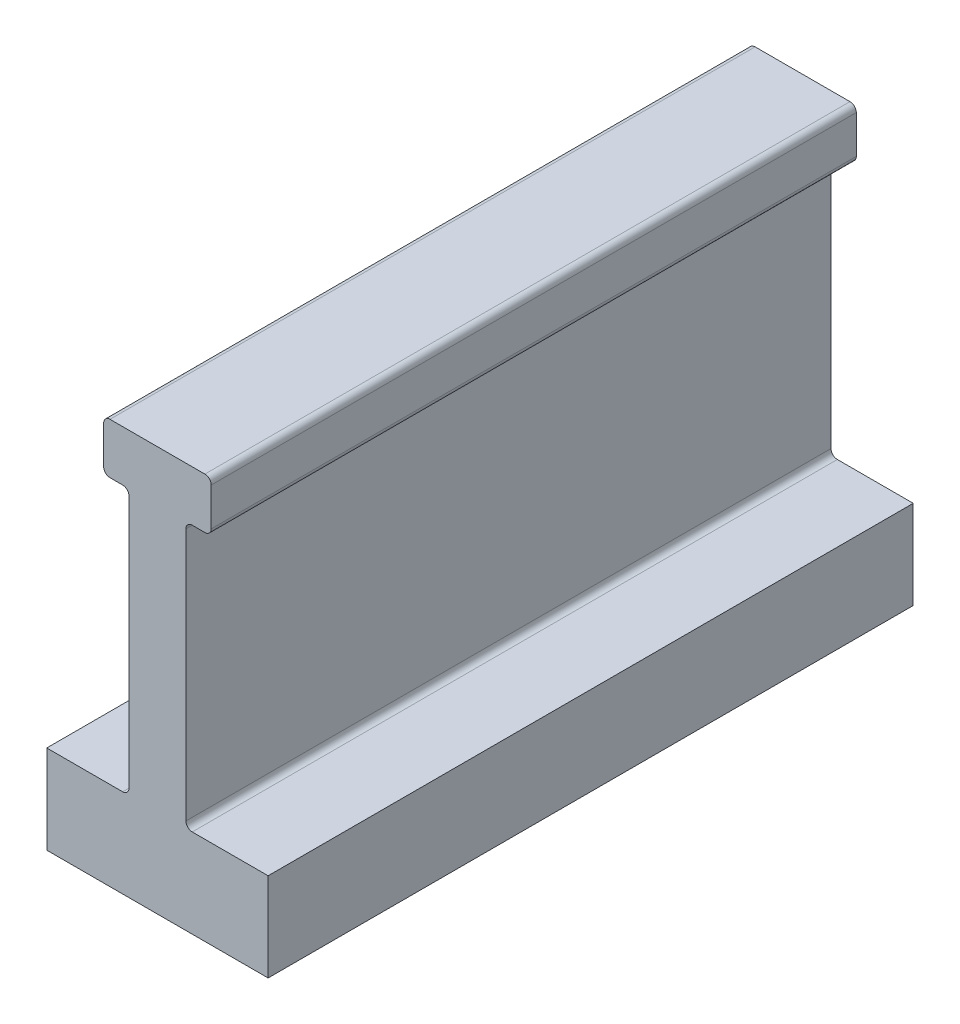
ISO-10303-21;
HEADER;
FILE_DESCRIPTION(('STEP AP214'),'2;1');
FILE_NAME('part.step','',(''),(''),'','','');
FILE_SCHEMA(('AUTOMOTIVE_DESIGN { 1 0 10303 214 1 1 1 1 }'));
ENDSEC;
DATA;
#1=APPLICATION_CONTEXT('core data for automotive mechanical design processes');
#2=APPLICATION_PROTOCOL_DEFINITION('international standard','automotive_design',2000,#1);
#3=PRODUCT_CONTEXT('',#1,'mechanical');
#4=PRODUCT('Part','Part','',(#3));
#5=PRODUCT_RELATED_PRODUCT_CATEGORY('part','',(#4));
#6=PRODUCT_DEFINITION_FORMATION('','',#4);
#7=PRODUCT_DEFINITION_CONTEXT('part definition',#1,'design');
#8=PRODUCT_DEFINITION('design','',#6,#7);
#9=PRODUCT_DEFINITION_SHAPE('','',#8);
#10=(LENGTH_UNIT() NAMED_UNIT(*) SI_UNIT(.MILLI.,.METRE.));
#11=(NAMED_UNIT(*) PLANE_ANGLE_UNIT() SI_UNIT($,.RADIAN.));
#12=(NAMED_UNIT(*) SI_UNIT($,.STERADIAN.) SOLID_ANGLE_UNIT());
#13=UNCERTAINTY_MEASURE_WITH_UNIT(LENGTH_MEASURE(1.E-05),#10,'distance_accuracy_value','');
#14=(GEOMETRIC_REPRESENTATION_CONTEXT(3) GLOBAL_UNCERTAINTY_ASSIGNED_CONTEXT((#13)) GLOBAL_UNIT_ASSIGNED_CONTEXT((#10,
#11,#12)) REPRESENTATION_CONTEXT('',''));
#15=CARTESIAN_POINT('',(0.,0.,0.));
#16=DIRECTION('',(0.,0.,1.));
#17=DIRECTION('',(1.,0.,0.));
#18=AXIS2_PLACEMENT_3D('',#15,#16,#17);
#19=CARTESIAN_POINT('',(-8.75,-7.,51.));
#20=DIRECTION('',(1.,0.,0.));
#21=DIRECTION('',(0.,0.,-1.));
#22=AXIS2_PLACEMENT_3D('',#19,#20,#21);
#23=PLANE('',#22);
#24=DIRECTION('',(0.,-1.,0.));
#25=VECTOR('',#24,1.);
#26=CARTESIAN_POINT('',(-8.75,-7.,0.));
#27=LINE('',#26,#25);
#28=CARTESIAN_POINT('',(-8.75,-7.,0.));
#29=VERTEX_POINT('',#28);
#30=CARTESIAN_POINT('',(-8.75,-14.,0.));
#31=VERTEX_POINT('',#30);
#32=EDGE_CURVE('E201',#29,#31,#27,.T.);
#33=ORIENTED_EDGE('',*,*,#32,.T.);
#34=DIRECTION('',(0.,0.,-1.));
#35=VECTOR('',#34,1.);
#36=CARTESIAN_POINT('',(-8.75,-14.,51.));
#37=LINE('',#36,#35);
#38=CARTESIAN_POINT('',(-8.75,-14.,51.));
#39=VERTEX_POINT('',#38);
#40=EDGE_CURVE('E11',#39,#31,#37,.T.);
#41=ORIENTED_EDGE('',*,*,#40,.F.);
#42=DIRECTION('',(0.,-1.,0.));
#43=VECTOR('',#42,1.);
#44=CARTESIAN_POINT('',(-8.75,-7.,51.));
#45=LINE('',#44,#43);
#46=CARTESIAN_POINT('',(-8.75,-7.,51.));
#47=VERTEX_POINT('',#46);
#48=EDGE_CURVE('E239',#47,#39,#45,.T.);
#49=ORIENTED_EDGE('',*,*,#48,.F.);
#50=DIRECTION('',(0.,0.,-1.));
#51=VECTOR('',#50,1.);
#52=CARTESIAN_POINT('',(-8.75,-7.,51.));
#53=LINE('',#52,#51);
#54=EDGE_CURVE('E197',#47,#29,#53,.T.);
#55=ORIENTED_EDGE('',*,*,#54,.T.);
#56=EDGE_LOOP('',(#33,#41,#49,#55));
#57=FACE_BOUND('',#56,.T.);
#58=ADVANCED_FACE('F33',(#57),#23,.F.);
#59=CARTESIAN_POINT('',(8.75,-14.,51.));
#60=DIRECTION('',(0.,1.,0.));
#61=DIRECTION('',(-1.,0.,0.));
#62=AXIS2_PLACEMENT_3D('',#59,#60,#61);
#63=PLANE('',#62);
#64=DIRECTION('',(1.,0.,0.));
#65=VECTOR('',#64,1.);
#66=CARTESIAN_POINT('',(8.75,-14.,0.));
#67=LINE('',#66,#65);
#68=CARTESIAN_POINT('',(8.75,-14.,0.));
#69=VERTEX_POINT('',#68);
#70=EDGE_CURVE('E204',#31,#69,#67,.T.);
#71=ORIENTED_EDGE('',*,*,#70,.T.);
#72=DIRECTION('',(0.,0.,-1.));
#73=VECTOR('',#72,1.);
#74=CARTESIAN_POINT('',(8.75,-14.,51.));
#75=LINE('',#74,#73);
#76=CARTESIAN_POINT('',(8.75,-14.,51.));
#77=VERTEX_POINT('',#76);
#78=EDGE_CURVE('E41',#77,#69,#75,.T.);
#79=ORIENTED_EDGE('',*,*,#78,.F.);
#80=DIRECTION('',(1.,0.,0.));
#81=VECTOR('',#80,1.);
#82=CARTESIAN_POINT('',(8.75,-14.,51.));
#83=LINE('',#82,#81);
#84=EDGE_CURVE('E128',#39,#77,#83,.T.);
#85=ORIENTED_EDGE('',*,*,#84,.F.);
#86=ORIENTED_EDGE('',*,*,#40,.T.);
#87=EDGE_LOOP('',(#71,#79,#85,#86));
#88=FACE_BOUND('',#87,.T.);
#89=ADVANCED_FACE('F357',(#88),#63,.F.);
#90=CARTESIAN_POINT('',(8.75,-14.,51.));
#91=DIRECTION('',(-1.,0.,0.));
#92=DIRECTION('',(0.,0.,1.));
#93=AXIS2_PLACEMENT_3D('',#90,#91,#92);
#94=PLANE('',#93);
#95=DIRECTION('',(0.,1.,0.));
#96=VECTOR('',#95,1.);
#97=CARTESIAN_POINT('',(8.75,-14.,0.));
#98=LINE('',#97,#96);
#99=CARTESIAN_POINT('',(8.75,-7.,0.));
#100=VERTEX_POINT('',#99);
#101=EDGE_CURVE('E206',#69,#100,#98,.T.);
#102=ORIENTED_EDGE('',*,*,#101,.T.);
#103=DIRECTION('',(0.,0.,-1.));
#104=VECTOR('',#103,1.);
#105=CARTESIAN_POINT('',(8.75,-7.,51.));
#106=LINE('',#105,#104);
#107=CARTESIAN_POINT('',(8.75,-7.,51.));
#108=VERTEX_POINT('',#107);
#109=EDGE_CURVE('E282',#108,#100,#106,.T.);
#110=ORIENTED_EDGE('',*,*,#109,.F.);
#111=DIRECTION('',(0.,1.,0.));
#112=VECTOR('',#111,1.);
#113=CARTESIAN_POINT('',(8.75,-14.,51.));
#114=LINE('',#113,#112);
#115=EDGE_CURVE('E290',#77,#108,#114,.T.);
#116=ORIENTED_EDGE('',*,*,#115,.F.);
#117=ORIENTED_EDGE('',*,*,#78,.T.);
#118=EDGE_LOOP('',(#102,#110,#116,#117));
#119=FACE_BOUND('',#118,.T.);
#120=ADVANCED_FACE('F288',(#119),#94,.F.);
#121=CARTESIAN_POINT('',(8.75,-7.,51.));
#122=DIRECTION('',(0.,-1.,0.));
#123=DIRECTION('',(0.,0.,-1.));
#124=AXIS2_PLACEMENT_3D('',#121,#122,#123);
#125=PLANE('',#124);
#126=DIRECTION('',(-1.,0.,0.));
#127=VECTOR('',#126,1.);
#128=CARTESIAN_POINT('',(8.75,-7.,0.));
#129=LINE('',#128,#127);
#130=CARTESIAN_POINT('',(2.75,-7.,0.));
#131=VERTEX_POINT('',#130);
#132=EDGE_CURVE('E208',#100,#131,#129,.T.);
#133=ORIENTED_EDGE('',*,*,#132,.T.);
#134=DIRECTION('',(0.,0.,-1.));
#135=VECTOR('',#134,1.);
#136=CARTESIAN_POINT('',(2.75,-7.,51.));
#137=LINE('',#136,#135);
#138=CARTESIAN_POINT('',(2.75,-7.,51.));
#139=VERTEX_POINT('',#138);
#140=EDGE_CURVE('E279',#139,#131,#137,.T.);
#141=ORIENTED_EDGE('',*,*,#140,.F.);
#142=DIRECTION('',(-1.,0.,0.));
#143=VECTOR('',#142,1.);
#144=CARTESIAN_POINT('',(8.75,-7.,51.));
#145=LINE('',#144,#143);
#146=EDGE_CURVE('E308',#108,#139,#145,.T.);
#147=ORIENTED_EDGE('',*,*,#146,.F.);
#148=ORIENTED_EDGE('',*,*,#109,.T.);
#149=EDGE_LOOP('',(#133,#141,#147,#148));
#150=FACE_BOUND('',#149,.T.);
#151=ADVANCED_FACE('F299',(#150),#125,.F.);
#152=CARTESIAN_POINT('',(2.75,-6.5,51.));
#153=DIRECTION('',(0.,0.,-1.));
#154=DIRECTION('',(-1.,0.,0.));
#155=AXIS2_PLACEMENT_3D('',#152,#153,#154);
#156=CYLINDRICAL_SURFACE('',#155,0.5);
#157=CARTESIAN_POINT('',(2.75,-6.5,0.));
#158=DIRECTION('',(0.,0.,-1.));
#159=DIRECTION('',(1.,0.,0.));
#160=AXIS2_PLACEMENT_3D('',#157,#158,#159);
#161=CIRCLE('',#160,0.5);
#162=CARTESIAN_POINT('',(2.25,-6.49999999999999,0.));
#163=VERTEX_POINT('',#162);
#164=EDGE_CURVE('E210',#131,#163,#161,.T.);
#165=ORIENTED_EDGE('',*,*,#164,.T.);
#166=DIRECTION('',(0.,0.,-1.));
#167=VECTOR('',#166,1.);
#168=CARTESIAN_POINT('',(2.25,-6.49999999999999,51.));
#169=LINE('',#168,#167);
#170=CARTESIAN_POINT('',(2.25,-6.49999999999999,51.));
#171=VERTEX_POINT('',#170);
#172=EDGE_CURVE('E276',#171,#163,#169,.T.);
#173=ORIENTED_EDGE('',*,*,#172,.F.);
#174=CARTESIAN_POINT('',(2.75,-6.5,51.));
#175=DIRECTION('',(0.,0.,-1.));
#176=DIRECTION('',(1.,0.,0.));
#177=AXIS2_PLACEMENT_3D('',#174,#175,#176);
#178=CIRCLE('',#177,0.5);
#179=EDGE_CURVE('E305',#139,#171,#178,.T.);
#180=ORIENTED_EDGE('',*,*,#179,.F.);
#181=ORIENTED_EDGE('',*,*,#140,.T.);
#182=EDGE_LOOP('',(#165,#173,#180,#181));
#183=FACE_BOUND('',#182,.T.);
#184=ADVANCED_FACE('F303',(#183),#156,.F.);
#185=CARTESIAN_POINT('',(2.25,-6.49999999999999,51.));
#186=DIRECTION('',(-1.,0.,0.));
#187=DIRECTION('',(0.,0.,1.));
#188=AXIS2_PLACEMENT_3D('',#185,#186,#187);
#189=PLANE('',#188);
#190=DIRECTION('',(0.,1.,0.));
#191=VECTOR('',#190,1.);
#192=CARTESIAN_POINT('',(2.25,-6.49999999999999,0.));
#193=LINE('',#192,#191);
#194=CARTESIAN_POINT('',(2.25,13.5,0.));
#195=VERTEX_POINT('',#194);
#196=EDGE_CURVE('E212',#163,#195,#193,.T.);
#197=ORIENTED_EDGE('',*,*,#196,.T.);
#198=DIRECTION('',(0.,0.,-1.));
#199=VECTOR('',#198,1.);
#200=CARTESIAN_POINT('',(2.25,13.5,51.));
#201=LINE('',#200,#199);
#202=CARTESIAN_POINT('',(2.25,13.5,51.));
#203=VERTEX_POINT('',#202);
#204=EDGE_CURVE('E273',#203,#195,#201,.T.);
#205=ORIENTED_EDGE('',*,*,#204,.F.);
#206=DIRECTION('',(0.,1.,0.));
#207=VECTOR('',#206,1.);
#208=CARTESIAN_POINT('',(2.25,-6.49999999999999,51.));
#209=LINE('',#208,#207);
#210=EDGE_CURVE('E307',#171,#203,#209,.T.);
#211=ORIENTED_EDGE('',*,*,#210,.F.);
#212=ORIENTED_EDGE('',*,*,#172,.T.);
#213=EDGE_LOOP('',(#197,#205,#211,#212));
#214=FACE_BOUND('',#213,.T.);
#215=ADVANCED_FACE('F370',(#214),#189,.F.);
#216=CARTESIAN_POINT('',(2.75,13.5,51.));
#217=DIRECTION('',(0.,0.,-1.));
#218=DIRECTION('',(-1.,0.,0.));
#219=AXIS2_PLACEMENT_3D('',#216,#217,#218);
#220=CYLINDRICAL_SURFACE('',#219,0.5);
#221=CARTESIAN_POINT('',(2.75,13.5,0.));
#222=DIRECTION('',(0.,0.,-1.));
#223=DIRECTION('',(1.,0.,0.));
#224=AXIS2_PLACEMENT_3D('',#221,#222,#223);
#225=CIRCLE('',#224,0.5);
#226=CARTESIAN_POINT('',(2.75,14.,0.));
#227=VERTEX_POINT('',#226);
#228=EDGE_CURVE('E214',#195,#227,#225,.T.);
#229=ORIENTED_EDGE('',*,*,#228,.T.);
#230=DIRECTION('',(0.,0.,-1.));
#231=VECTOR('',#230,1.);
#232=CARTESIAN_POINT('',(2.75,14.,51.));
#233=LINE('',#232,#231);
#234=CARTESIAN_POINT('',(2.75,14.,51.));
#235=VERTEX_POINT('',#234);
#236=EDGE_CURVE('E270',#235,#227,#233,.T.);
#237=ORIENTED_EDGE('',*,*,#236,.F.);
#238=CARTESIAN_POINT('',(2.75,13.5,51.));
#239=DIRECTION('',(0.,0.,-1.));
#240=DIRECTION('',(1.,0.,0.));
#241=AXIS2_PLACEMENT_3D('',#238,#239,#240);
#242=CIRCLE('',#241,0.5);
#243=EDGE_CURVE('E310',#203,#235,#242,.T.);
#244=ORIENTED_EDGE('',*,*,#243,.F.);
#245=ORIENTED_EDGE('',*,*,#204,.T.);
#246=EDGE_LOOP('',(#229,#237,#244,#245));
#247=FACE_BOUND('',#246,.T.);
#248=ADVANCED_FACE('F373',(#247),#220,.F.);
#249=CARTESIAN_POINT('',(2.75,14.,51.));
#250=DIRECTION('',(0.,1.,0.));
#251=DIRECTION('',(0.,0.,1.));
#252=AXIS2_PLACEMENT_3D('',#249,#250,#251);
#253=PLANE('',#252);
#254=DIRECTION('',(1.,0.,0.));
#255=VECTOR('',#254,1.);
#256=CARTESIAN_POINT('',(2.75,14.,0.));
#257=LINE('',#256,#255);
#258=CARTESIAN_POINT('',(3.74999999999999,14.,0.));
#259=VERTEX_POINT('',#258);
#260=EDGE_CURVE('E216',#227,#259,#257,.T.);
#261=ORIENTED_EDGE('',*,*,#260,.T.);
#262=DIRECTION('',(0.,0.,-1.));
#263=VECTOR('',#262,1.);
#264=CARTESIAN_POINT('',(3.74999999999999,14.,51.));
#265=LINE('',#264,#263);
#266=CARTESIAN_POINT('',(3.74999999999999,14.,51.));
#267=VERTEX_POINT('',#266);
#268=EDGE_CURVE('E267',#267,#259,#265,.T.);
#269=ORIENTED_EDGE('',*,*,#268,.F.);
#270=DIRECTION('',(1.,0.,0.));
#271=VECTOR('',#270,1.);
#272=CARTESIAN_POINT('',(2.75,14.,51.));
#273=LINE('',#272,#271);
#274=EDGE_CURVE('E316',#235,#267,#273,.T.);
#275=ORIENTED_EDGE('',*,*,#274,.F.);
#276=ORIENTED_EDGE('',*,*,#236,.T.);
#277=EDGE_LOOP('',(#261,#269,#275,#276));
#278=FACE_BOUND('',#277,.T.);
#279=ADVANCED_FACE('F377',(#278),#253,.F.);
#280=CARTESIAN_POINT('',(3.75,14.5,51.));
#281=DIRECTION('',(0.,0.,-1.));
#282=DIRECTION('',(-1.,0.,0.));
#283=AXIS2_PLACEMENT_3D('',#280,#281,#282);
#284=CYLINDRICAL_SURFACE('',#283,0.5);
#285=CARTESIAN_POINT('',(3.75,14.5,0.));
#286=DIRECTION('',(0.,0.,1.));
#287=DIRECTION('',(1.,0.,0.));
#288=AXIS2_PLACEMENT_3D('',#285,#286,#287);
#289=CIRCLE('',#288,0.5);
#290=CARTESIAN_POINT('',(4.25,14.5,0.));
#291=VERTEX_POINT('',#290);
#292=EDGE_CURVE('E218',#259,#291,#289,.T.);
#293=ORIENTED_EDGE('',*,*,#292,.T.);
#294=DIRECTION('',(0.,0.,-1.));
#295=VECTOR('',#294,1.);
#296=CARTESIAN_POINT('',(4.25,14.5,51.));
#297=LINE('',#296,#295);
#298=CARTESIAN_POINT('',(4.25,14.5,51.));
#299=VERTEX_POINT('',#298);
#300=EDGE_CURVE('E264',#299,#291,#297,.T.);
#301=ORIENTED_EDGE('',*,*,#300,.F.);
#302=CARTESIAN_POINT('',(3.75,14.5,51.));
#303=DIRECTION('',(0.,0.,1.));
#304=DIRECTION('',(1.,0.,0.));
#305=AXIS2_PLACEMENT_3D('',#302,#303,#304);
#306=CIRCLE('',#305,0.5);
#307=EDGE_CURVE('E318',#267,#299,#306,.T.);
#308=ORIENTED_EDGE('',*,*,#307,.F.);
#309=ORIENTED_EDGE('',*,*,#268,.T.);
#310=EDGE_LOOP('',(#293,#301,#308,#309));
#311=FACE_BOUND('',#310,.T.);
#312=ADVANCED_FACE('F381',(#311),#284,.T.);
#313=CARTESIAN_POINT('',(4.25,17.5,51.));
#314=DIRECTION('',(-1.,0.,0.));
#315=DIRECTION('',(0.,-1.,0.));
#316=AXIS2_PLACEMENT_3D('',#313,#314,#315);
#317=PLANE('',#316);
#318=DIRECTION('',(0.,1.,0.));
#319=VECTOR('',#318,1.);
#320=CARTESIAN_POINT('',(4.25,17.5,0.));
#321=LINE('',#320,#319);
#322=CARTESIAN_POINT('',(4.25,17.5,0.));
#323=VERTEX_POINT('',#322);
#324=EDGE_CURVE('E220',#291,#323,#321,.T.);
#325=ORIENTED_EDGE('',*,*,#324,.T.);
#326=DIRECTION('',(0.,0.,-1.));
#327=VECTOR('',#326,1.);
#328=CARTESIAN_POINT('',(4.25,17.5,51.));
#329=LINE('',#328,#327);
#330=CARTESIAN_POINT('',(4.25,17.5,51.));
#331=VERTEX_POINT('',#330);
#332=EDGE_CURVE('E261',#331,#323,#329,.T.);
#333=ORIENTED_EDGE('',*,*,#332,.F.);
#334=DIRECTION('',(0.,1.,0.));
#335=VECTOR('',#334,1.);
#336=CARTESIAN_POINT('',(4.25,17.5,51.));
#337=LINE('',#336,#335);
#338=EDGE_CURVE('E320',#299,#331,#337,.T.);
#339=ORIENTED_EDGE('',*,*,#338,.F.);
#340=ORIENTED_EDGE('',*,*,#300,.T.);
#341=EDGE_LOOP('',(#325,#333,#339,#340));
#342=FACE_BOUND('',#341,.T.);
#343=ADVANCED_FACE('F385',(#342),#317,.F.);
#344=CARTESIAN_POINT('',(3.75,17.5,51.));
#345=DIRECTION('',(0.,0.,-1.));
#346=DIRECTION('',(-1.,0.,0.));
#347=AXIS2_PLACEMENT_3D('',#344,#345,#346);
#348=CYLINDRICAL_SURFACE('',#347,0.5);
#349=CARTESIAN_POINT('',(3.75,17.5,0.));
#350=DIRECTION('',(0.,0.,1.));
#351=DIRECTION('',(-1.,0.,0.));
#352=AXIS2_PLACEMENT_3D('',#349,#350,#351);
#353=CIRCLE('',#352,0.5);
#354=CARTESIAN_POINT('',(3.74999999999999,18.,0.));
#355=VERTEX_POINT('',#354);
#356=EDGE_CURVE('E222',#323,#355,#353,.T.);
#357=ORIENTED_EDGE('',*,*,#356,.T.);
#358=DIRECTION('',(0.,0.,-1.));
#359=VECTOR('',#358,1.);
#360=CARTESIAN_POINT('',(3.74999999999999,18.,51.));
#361=LINE('',#360,#359);
#362=CARTESIAN_POINT('',(3.74999999999999,18.,51.));
#363=VERTEX_POINT('',#362);
#364=EDGE_CURVE('E258',#363,#355,#361,.T.);
#365=ORIENTED_EDGE('',*,*,#364,.F.);
#366=CARTESIAN_POINT('',(3.75,17.5,51.));
#367=DIRECTION('',(0.,0.,1.));
#368=DIRECTION('',(-1.,0.,0.));
#369=AXIS2_PLACEMENT_3D('',#366,#367,#368);
#370=CIRCLE('',#369,0.5);
#371=EDGE_CURVE('E322',#331,#363,#370,.T.);
#372=ORIENTED_EDGE('',*,*,#371,.F.);
#373=ORIENTED_EDGE('',*,*,#332,.T.);
#374=EDGE_LOOP('',(#357,#365,#372,#373));
#375=FACE_BOUND('',#374,.T.);
#376=ADVANCED_FACE('F389',(#375),#348,.T.);
#377=CARTESIAN_POINT('',(-3.75,18.,51.));
#378=DIRECTION('',(0.,-1.,0.));
#379=DIRECTION('',(1.,0.,0.));
#380=AXIS2_PLACEMENT_3D('',#377,#378,#379);
#381=PLANE('',#380);
#382=DIRECTION('',(-1.,0.,0.));
#383=VECTOR('',#382,1.);
#384=CARTESIAN_POINT('',(-3.75,18.,0.));
#385=LINE('',#384,#383);
#386=CARTESIAN_POINT('',(-3.75,18.,0.));
#387=VERTEX_POINT('',#386);
#388=EDGE_CURVE('E224',#355,#387,#385,.T.);
#389=ORIENTED_EDGE('',*,*,#388,.T.);
#390=DIRECTION('',(0.,0.,-1.));
#391=VECTOR('',#390,1.);
#392=CARTESIAN_POINT('',(-3.75,18.,51.));
#393=LINE('',#392,#391);
#394=CARTESIAN_POINT('',(-3.75,18.,51.));
#395=VERTEX_POINT('',#394);
#396=EDGE_CURVE('E255',#395,#387,#393,.T.);
#397=ORIENTED_EDGE('',*,*,#396,.F.);
#398=DIRECTION('',(-1.,0.,0.));
#399=VECTOR('',#398,1.);
#400=CARTESIAN_POINT('',(-3.75,18.,51.));
#401=LINE('',#400,#399);
#402=EDGE_CURVE('E324',#363,#395,#401,.T.);
#403=ORIENTED_EDGE('',*,*,#402,.F.);
#404=ORIENTED_EDGE('',*,*,#364,.T.);
#405=EDGE_LOOP('',(#389,#397,#403,#404));
#406=FACE_BOUND('',#405,.T.);
#407=ADVANCED_FACE('F393',(#406),#381,.F.);
#408=CARTESIAN_POINT('',(-3.75,17.5,51.));
#409=DIRECTION('',(0.,0.,-1.));
#410=DIRECTION('',(-1.,0.,0.));
#411=AXIS2_PLACEMENT_3D('',#408,#409,#410);
#412=CYLINDRICAL_SURFACE('',#411,0.5);
#413=CARTESIAN_POINT('',(-3.75,17.5,0.));
#414=DIRECTION('',(0.,0.,1.));
#415=DIRECTION('',(1.,0.,0.));
#416=AXIS2_PLACEMENT_3D('',#413,#414,#415);
#417=CIRCLE('',#416,0.5);
#418=CARTESIAN_POINT('',(-4.25,17.5,0.));
#419=VERTEX_POINT('',#418);
#420=EDGE_CURVE('E226',#387,#419,#417,.T.);
#421=ORIENTED_EDGE('',*,*,#420,.T.);
#422=DIRECTION('',(0.,0.,-1.));
#423=VECTOR('',#422,1.);
#424=CARTESIAN_POINT('',(-4.25,17.5,51.));
#425=LINE('',#424,#423);
#426=CARTESIAN_POINT('',(-4.25,17.5,51.));
#427=VERTEX_POINT('',#426);
#428=EDGE_CURVE('E252',#427,#419,#425,.T.);
#429=ORIENTED_EDGE('',*,*,#428,.F.);
#430=CARTESIAN_POINT('',(-3.75,17.5,51.));
#431=DIRECTION('',(0.,0.,1.));
#432=DIRECTION('',(1.,0.,0.));
#433=AXIS2_PLACEMENT_3D('',#430,#431,#432);
#434=CIRCLE('',#433,0.5);
#435=EDGE_CURVE('E326',#395,#427,#434,.T.);
#436=ORIENTED_EDGE('',*,*,#435,.F.);
#437=ORIENTED_EDGE('',*,*,#396,.T.);
#438=EDGE_LOOP('',(#421,#429,#436,#437));
#439=FACE_BOUND('',#438,.T.);
#440=ADVANCED_FACE('F397',(#439),#412,.T.);
#441=CARTESIAN_POINT('',(-4.25,17.5,51.));
#442=DIRECTION('',(1.,0.,0.));
#443=DIRECTION('',(0.,0.,-1.));
#444=AXIS2_PLACEMENT_3D('',#441,#442,#443);
#445=PLANE('',#444);
#446=DIRECTION('',(0.,-1.,0.));
#447=VECTOR('',#446,1.);
#448=CARTESIAN_POINT('',(-4.25,17.5,0.));
#449=LINE('',#448,#447);
#450=CARTESIAN_POINT('',(-4.25,14.5,0.));
#451=VERTEX_POINT('',#450);
#452=EDGE_CURVE('E228',#419,#451,#449,.T.);
#453=ORIENTED_EDGE('',*,*,#452,.T.);
#454=DIRECTION('',(0.,0.,-1.));
#455=VECTOR('',#454,1.);
#456=CARTESIAN_POINT('',(-4.25,14.5,51.));
#457=LINE('',#456,#455);
#458=CARTESIAN_POINT('',(-4.25,14.5,51.));
#459=VERTEX_POINT('',#458);
#460=EDGE_CURVE('E249',#459,#451,#457,.T.);
#461=ORIENTED_EDGE('',*,*,#460,.F.);
#462=DIRECTION('',(0.,-1.,0.));
#463=VECTOR('',#462,1.);
#464=CARTESIAN_POINT('',(-4.25,17.5,51.));
#465=LINE('',#464,#463);
#466=EDGE_CURVE('E328',#427,#459,#465,.T.);
#467=ORIENTED_EDGE('',*,*,#466,.F.);
#468=ORIENTED_EDGE('',*,*,#428,.T.);
#469=EDGE_LOOP('',(#453,#461,#467,#468));
#470=FACE_BOUND('',#469,.T.);
#471=ADVANCED_FACE('F401',(#470),#445,.F.);
#472=CARTESIAN_POINT('',(-3.75,14.5,51.));
#473=DIRECTION('',(0.,0.,-1.));
#474=DIRECTION('',(-1.,0.,0.));
#475=AXIS2_PLACEMENT_3D('',#472,#473,#474);
#476=CYLINDRICAL_SURFACE('',#475,0.5);
#477=CARTESIAN_POINT('',(-3.75,14.5,0.));
#478=DIRECTION('',(0.,0.,1.));
#479=DIRECTION('',(1.,0.,0.));
#480=AXIS2_PLACEMENT_3D('',#477,#478,#479);
#481=CIRCLE('',#480,0.5);
#482=CARTESIAN_POINT('',(-3.75,14.,0.));
#483=VERTEX_POINT('',#482);
#484=EDGE_CURVE('E230',#451,#483,#481,.T.);
#485=ORIENTED_EDGE('',*,*,#484,.T.);
#486=DIRECTION('',(0.,0.,-1.));
#487=VECTOR('',#486,1.);
#488=CARTESIAN_POINT('',(-3.75,14.,51.));
#489=LINE('',#488,#487);
#490=CARTESIAN_POINT('',(-3.75,14.,51.));
#491=VERTEX_POINT('',#490);
#492=EDGE_CURVE('E246',#491,#483,#489,.T.);
#493=ORIENTED_EDGE('',*,*,#492,.F.);
#494=CARTESIAN_POINT('',(-3.75,14.5,51.));
#495=DIRECTION('',(0.,0.,1.));
#496=DIRECTION('',(1.,0.,0.));
#497=AXIS2_PLACEMENT_3D('',#494,#495,#496);
#498=CIRCLE('',#497,0.5);
#499=EDGE_CURVE('E330',#459,#491,#498,.T.);
#500=ORIENTED_EDGE('',*,*,#499,.F.);
#501=ORIENTED_EDGE('',*,*,#460,.T.);
#502=EDGE_LOOP('',(#485,#493,#500,#501));
#503=FACE_BOUND('',#502,.T.);
#504=ADVANCED_FACE('F405',(#503),#476,.T.);
#505=CARTESIAN_POINT('',(-3.75,14.,51.));
#506=DIRECTION('',(0.,1.,0.));
#507=DIRECTION('',(0.,0.,1.));
#508=AXIS2_PLACEMENT_3D('',#505,#506,#507);
#509=PLANE('',#508);
#510=DIRECTION('',(1.,0.,0.));
#511=VECTOR('',#510,1.);
#512=CARTESIAN_POINT('',(-3.75,14.,0.));
#513=LINE('',#512,#511);
#514=CARTESIAN_POINT('',(-2.75,14.,0.));
#515=VERTEX_POINT('',#514);
#516=EDGE_CURVE('E232',#483,#515,#513,.T.);
#517=ORIENTED_EDGE('',*,*,#516,.T.);
#518=DIRECTION('',(0.,0.,-1.));
#519=VECTOR('',#518,1.);
#520=CARTESIAN_POINT('',(-2.75,14.,51.));
#521=LINE('',#520,#519);
#522=CARTESIAN_POINT('',(-2.75,14.,51.));
#523=VERTEX_POINT('',#522);
#524=EDGE_CURVE('E243',#523,#515,#521,.T.);
#525=ORIENTED_EDGE('',*,*,#524,.F.);
#526=DIRECTION('',(1.,0.,0.));
#527=VECTOR('',#526,1.);
#528=CARTESIAN_POINT('',(-3.75,14.,51.));
#529=LINE('',#528,#527);
#530=EDGE_CURVE('E332',#491,#523,#529,.T.);
#531=ORIENTED_EDGE('',*,*,#530,.F.);
#532=ORIENTED_EDGE('',*,*,#492,.T.);
#533=EDGE_LOOP('',(#517,#525,#531,#532));
#534=FACE_BOUND('',#533,.T.);
#535=ADVANCED_FACE('F338',(#534),#509,.F.);
#536=CARTESIAN_POINT('',(-2.75,13.5,51.));
#537=DIRECTION('',(0.,0.,-1.));
#538=DIRECTION('',(-1.,0.,0.));
#539=AXIS2_PLACEMENT_3D('',#536,#537,#538);
#540=CYLINDRICAL_SURFACE('',#539,0.5);
#541=CARTESIAN_POINT('',(-2.75,13.5,0.));
#542=DIRECTION('',(0.,0.,-1.));
#543=DIRECTION('',(1.,0.,0.));
#544=AXIS2_PLACEMENT_3D('',#541,#542,#543);
#545=CIRCLE('',#544,0.5);
#546=CARTESIAN_POINT('',(-2.25,13.5,0.));
#547=VERTEX_POINT('',#546);
#548=EDGE_CURVE('E234',#515,#547,#545,.T.);
#549=ORIENTED_EDGE('',*,*,#548,.T.);
#550=DIRECTION('',(0.,0.,-1.));
#551=VECTOR('',#550,1.);
#552=CARTESIAN_POINT('',(-2.25,13.5,51.));
#553=LINE('',#552,#551);
#554=CARTESIAN_POINT('',(-2.25,13.5,51.));
#555=VERTEX_POINT('',#554);
#556=EDGE_CURVE('E192',#555,#547,#553,.T.);
#557=ORIENTED_EDGE('',*,*,#556,.F.);
#558=CARTESIAN_POINT('',(-2.75,13.5,51.));
#559=DIRECTION('',(0.,0.,-1.));
#560=DIRECTION('',(1.,0.,0.));
#561=AXIS2_PLACEMENT_3D('',#558,#559,#560);
#562=CIRCLE('',#561,0.5);
#563=EDGE_CURVE('E183',#523,#555,#562,.T.);
#564=ORIENTED_EDGE('',*,*,#563,.F.);
#565=ORIENTED_EDGE('',*,*,#524,.T.);
#566=EDGE_LOOP('',(#549,#557,#564,#565));
#567=FACE_BOUND('',#566,.T.);
#568=ADVANCED_FACE('F342',(#567),#540,.F.);
#569=CARTESIAN_POINT('',(-2.25,-6.5,51.));
#570=DIRECTION('',(1.,0.,0.));
#571=DIRECTION('',(0.,1.,0.));
#572=AXIS2_PLACEMENT_3D('',#569,#570,#571);
#573=PLANE('',#572);
#574=DIRECTION('',(0.,-1.,0.));
#575=VECTOR('',#574,1.);
#576=CARTESIAN_POINT('',(-2.25,-6.5,0.));
#577=LINE('',#576,#575);
#578=CARTESIAN_POINT('',(-2.25,-6.5,0.));
#579=VERTEX_POINT('',#578);
#580=EDGE_CURVE('E191',#547,#579,#577,.T.);
#581=ORIENTED_EDGE('',*,*,#580,.T.);
#582=DIRECTION('',(0.,0.,-1.));
#583=VECTOR('',#582,1.);
#584=CARTESIAN_POINT('',(-2.25,-6.5,51.));
#585=LINE('',#584,#583);
#586=CARTESIAN_POINT('',(-2.25,-6.5,51.));
#587=VERTEX_POINT('',#586);
#588=EDGE_CURVE('E188',#587,#579,#585,.T.);
#589=ORIENTED_EDGE('',*,*,#588,.F.);
#590=DIRECTION('',(0.,-1.,0.));
#591=VECTOR('',#590,1.);
#592=CARTESIAN_POINT('',(-2.25,-6.5,51.));
#593=LINE('',#592,#591);
#594=EDGE_CURVE('E177',#555,#587,#593,.T.);
#595=ORIENTED_EDGE('',*,*,#594,.F.);
#596=ORIENTED_EDGE('',*,*,#556,.T.);
#597=EDGE_LOOP('',(#581,#589,#595,#596));
#598=FACE_BOUND('',#597,.T.);
#599=ADVANCED_FACE('F189',(#598),#573,.F.);
#600=CARTESIAN_POINT('',(-2.75,-6.5,51.));
#601=DIRECTION('',(0.,0.,-1.));
#602=DIRECTION('',(-1.,0.,0.));
#603=AXIS2_PLACEMENT_3D('',#600,#601,#602);
#604=CYLINDRICAL_SURFACE('',#603,0.5);
#605=CARTESIAN_POINT('',(-2.75,-6.5,0.));
#606=DIRECTION('',(0.,0.,-1.));
#607=DIRECTION('',(-1.,0.,0.));
#608=AXIS2_PLACEMENT_3D('',#605,#606,#607);
#609=CIRCLE('',#608,0.5);
#610=CARTESIAN_POINT('',(-2.75,-7.,0.));
#611=VERTEX_POINT('',#610);
#612=EDGE_CURVE('E114',#579,#611,#609,.T.);
#613=ORIENTED_EDGE('',*,*,#612,.T.);
#614=DIRECTION('',(0.,0.,-1.));
#615=VECTOR('',#614,1.);
#616=CARTESIAN_POINT('',(-2.75,-7.,51.));
#617=LINE('',#616,#615);
#618=CARTESIAN_POINT('',(-2.75,-7.,51.));
#619=VERTEX_POINT('',#618);
#620=EDGE_CURVE('E193',#619,#611,#617,.T.);
#621=ORIENTED_EDGE('',*,*,#620,.F.);
#622=CARTESIAN_POINT('',(-2.75,-6.5,51.));
#623=DIRECTION('',(0.,0.,-1.));
#624=DIRECTION('',(-1.,0.,0.));
#625=AXIS2_PLACEMENT_3D('',#622,#623,#624);
#626=CIRCLE('',#625,0.5);
#627=EDGE_CURVE('E181',#587,#619,#626,.T.);
#628=ORIENTED_EDGE('',*,*,#627,.F.);
#629=ORIENTED_EDGE('',*,*,#588,.T.);
#630=EDGE_LOOP('',(#613,#621,#628,#629));
#631=FACE_BOUND('',#630,.T.);
#632=ADVANCED_FACE('F195',(#631),#604,.F.);
#633=CARTESIAN_POINT('',(-2.75,-7.,51.));
#634=DIRECTION('',(0.,-1.,0.));
#635=DIRECTION('',(0.,0.,-1.));
#636=AXIS2_PLACEMENT_3D('',#633,#634,#635);
#637=PLANE('',#636);
#638=DIRECTION('',(-1.,0.,0.));
#639=VECTOR('',#638,1.);
#640=CARTESIAN_POINT('',(-2.75,-7.,0.));
#641=LINE('',#640,#639);
#642=EDGE_CURVE('E120',#611,#29,#641,.T.);
#643=ORIENTED_EDGE('',*,*,#642,.T.);
#644=ORIENTED_EDGE('',*,*,#54,.F.);
#645=DIRECTION('',(-1.,0.,0.));
#646=VECTOR('',#645,1.);
#647=CARTESIAN_POINT('',(-2.75,-7.,51.));
#648=LINE('',#647,#646);
#649=EDGE_CURVE('E49',#619,#47,#648,.T.);
#650=ORIENTED_EDGE('',*,*,#649,.F.);
#651=ORIENTED_EDGE('',*,*,#620,.T.);
#652=EDGE_LOOP('',(#643,#644,#650,#651));
#653=FACE_BOUND('',#652,.T.);
#654=ADVANCED_FACE('F346',(#653),#637,.F.);
#655=CARTESIAN_POINT('',(2.75,-6.5,51.));
#656=DIRECTION('',(0.,0.,1.));
#657=DIRECTION('',(1.,0.,0.));
#658=AXIS2_PLACEMENT_3D('',#655,#656,#657);
#659=PLANE('',#658);
#660=ORIENTED_EDGE('',*,*,#48,.T.);
#661=ORIENTED_EDGE('',*,*,#84,.T.);
#662=ORIENTED_EDGE('',*,*,#115,.T.);
#663=ORIENTED_EDGE('',*,*,#146,.T.);
#664=ORIENTED_EDGE('',*,*,#179,.T.);
#665=ORIENTED_EDGE('',*,*,#210,.T.);
#666=ORIENTED_EDGE('',*,*,#243,.T.);
#667=ORIENTED_EDGE('',*,*,#274,.T.);
#668=ORIENTED_EDGE('',*,*,#307,.T.);
#669=ORIENTED_EDGE('',*,*,#338,.T.);
#670=ORIENTED_EDGE('',*,*,#371,.T.);
#671=ORIENTED_EDGE('',*,*,#402,.T.);
#672=ORIENTED_EDGE('',*,*,#435,.T.);
#673=ORIENTED_EDGE('',*,*,#466,.T.);
#674=ORIENTED_EDGE('',*,*,#499,.T.);
#675=ORIENTED_EDGE('',*,*,#530,.T.);
#676=ORIENTED_EDGE('',*,*,#563,.T.);
#677=ORIENTED_EDGE('',*,*,#594,.T.);
#678=ORIENTED_EDGE('',*,*,#627,.T.);
#679=ORIENTED_EDGE('',*,*,#649,.T.);
#680=EDGE_LOOP('',(#660,#661,#662,#663,#664,#665,#666,#667,#668,#669,#670,#671,#672,#673,#674,
#675,#676,#677,#678,#679));
#681=FACE_BOUND('',#680,.T.);
#682=ADVANCED_FACE('F179',(#681),#659,.T.);
#683=CARTESIAN_POINT('',(2.75,-6.5,0.));
#684=DIRECTION('',(0.,0.,1.));
#685=DIRECTION('',(1.,0.,0.));
#686=AXIS2_PLACEMENT_3D('',#683,#684,#685);
#687=PLANE('',#686);
#688=ORIENTED_EDGE('',*,*,#32,.F.);
#689=ORIENTED_EDGE('',*,*,#642,.F.);
#690=ORIENTED_EDGE('',*,*,#612,.F.);
#691=ORIENTED_EDGE('',*,*,#580,.F.);
#692=ORIENTED_EDGE('',*,*,#548,.F.);
#693=ORIENTED_EDGE('',*,*,#516,.F.);
#694=ORIENTED_EDGE('',*,*,#484,.F.);
#695=ORIENTED_EDGE('',*,*,#452,.F.);
#696=ORIENTED_EDGE('',*,*,#420,.F.);
#697=ORIENTED_EDGE('',*,*,#388,.F.);
#698=ORIENTED_EDGE('',*,*,#356,.F.);
#699=ORIENTED_EDGE('',*,*,#324,.F.);
#700=ORIENTED_EDGE('',*,*,#292,.F.);
#701=ORIENTED_EDGE('',*,*,#260,.F.);
#702=ORIENTED_EDGE('',*,*,#228,.F.);
#703=ORIENTED_EDGE('',*,*,#196,.F.);
#704=ORIENTED_EDGE('',*,*,#164,.F.);
#705=ORIENTED_EDGE('',*,*,#132,.F.);
#706=ORIENTED_EDGE('',*,*,#101,.F.);
#707=ORIENTED_EDGE('',*,*,#70,.F.);
#708=EDGE_LOOP('',(#688,#689,#690,#691,#692,#693,#694,#695,#696,#697,#698,#699,#700,#701,#702,
#703,#704,#705,#706,#707));
#709=FACE_BOUND('',#708,.T.);
#710=ADVANCED_FACE('F294',(#709),#687,.F.);
#711=CLOSED_SHELL('',(#58,#89,#120,#151,#184,#215,#248,#279,#312,#343,#376,#407,#440,#471,#504,
#535,#568,#599,#632,#654,#682,#710));
#712=MANIFOLD_SOLID_BREP('B2',#711);
#713=ADVANCED_BREP_SHAPE_REPRESENTATION('',(#18,#712),#14);
#714=SHAPE_DEFINITION_REPRESENTATION(#9,#713);
ENDSEC;
END-ISO-10303-21;
